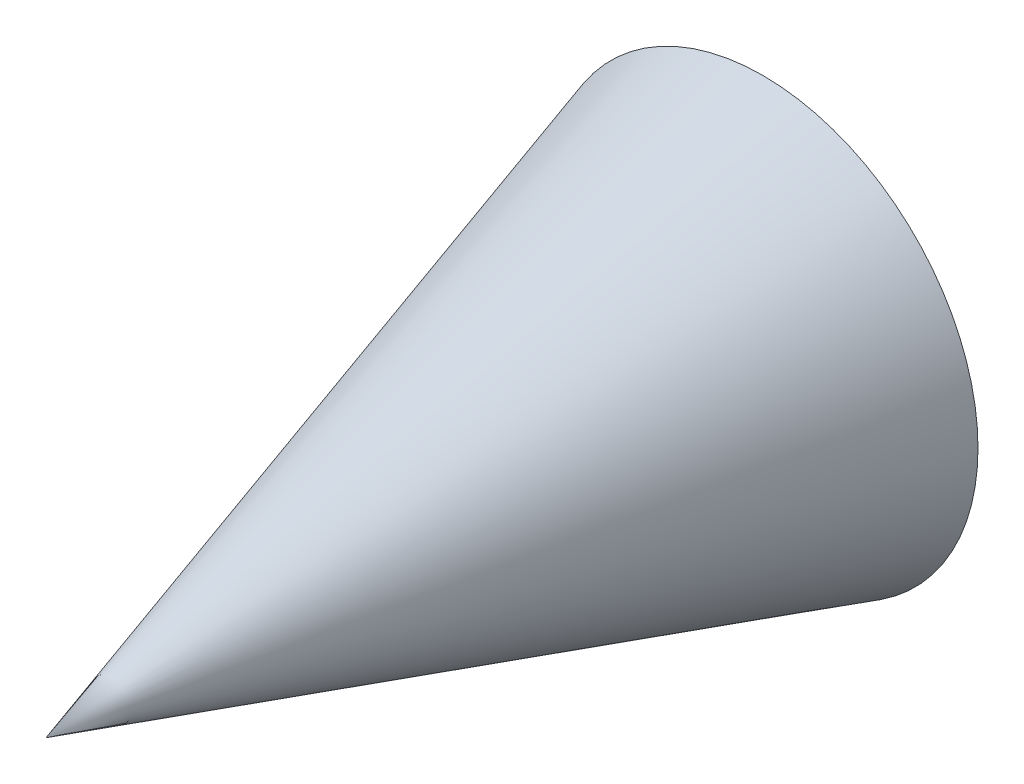
ISO-10303-21;
HEADER;
FILE_DESCRIPTION(('STEP AP214'),'2;1');
FILE_NAME('part.step','',(''),(''),'','','');
FILE_SCHEMA(('AUTOMOTIVE_DESIGN { 1 0 10303 214 1 1 1 1 }'));
ENDSEC;
DATA;
#1=APPLICATION_CONTEXT('core data for automotive mechanical design processes');
#2=APPLICATION_PROTOCOL_DEFINITION('international standard','automotive_design',2000,#1);
#3=PRODUCT_CONTEXT('',#1,'mechanical');
#4=PRODUCT('Part','Part','',(#3));
#5=PRODUCT_RELATED_PRODUCT_CATEGORY('part','',(#4));
#6=PRODUCT_DEFINITION_FORMATION('','',#4);
#7=PRODUCT_DEFINITION_CONTEXT('part definition',#1,'design');
#8=PRODUCT_DEFINITION('design','',#6,#7);
#9=PRODUCT_DEFINITION_SHAPE('','',#8);
#10=(LENGTH_UNIT() NAMED_UNIT(*) SI_UNIT(.MILLI.,.METRE.));
#11=(NAMED_UNIT(*) PLANE_ANGLE_UNIT() SI_UNIT($,.RADIAN.));
#12=(NAMED_UNIT(*) SI_UNIT($,.STERADIAN.) SOLID_ANGLE_UNIT());
#13=UNCERTAINTY_MEASURE_WITH_UNIT(LENGTH_MEASURE(1.E-05),#10,'distance_accuracy_value','');
#14=(GEOMETRIC_REPRESENTATION_CONTEXT(3) GLOBAL_UNCERTAINTY_ASSIGNED_CONTEXT((#13)) GLOBAL_UNIT_ASSIGNED_CONTEXT((#10,
#11,#12)) REPRESENTATION_CONTEXT('',''));
#15=CARTESIAN_POINT('',(0.,0.,0.));
#16=DIRECTION('',(0.,0.,1.));
#17=DIRECTION('',(1.,0.,0.));
#18=AXIS2_PLACEMENT_3D('',#15,#16,#17);
#19=CARTESIAN_POINT('',(0.,0.,0.));
#20=DIRECTION('',(0.,0.,-1.));
#21=DIRECTION('',(-1.,0.,0.));
#22=AXIS2_PLACEMENT_3D('',#19,#20,#21);
#23=PLANE('',#22);
#24=CARTESIAN_POINT('',(0.,0.,0.));
#25=DIRECTION('',(0.,0.,-1.));
#26=DIRECTION('',(-1.,0.,0.));
#27=AXIS2_PLACEMENT_3D('',#24,#25,#26);
#28=CIRCLE('',#27,30.);
#29=CARTESIAN_POINT('',(-30.,0.,0.));
#30=VERTEX_POINT('',#29);
#31=EDGE_CURVE('E11',#30,#30,#28,.T.);
#32=ORIENTED_EDGE('',*,*,#31,.T.);
#33=EDGE_LOOP('',(#32));
#34=FACE_BOUND('',#33,.T.);
#35=ADVANCED_FACE('F39',(#34),#23,.T.);
#36=CARTESIAN_POINT('',(0.,0.,0.));
#37=DIRECTION('',(0.,0.,-1.));
#38=DIRECTION('',(-1.,0.,0.));
#39=AXIS2_PLACEMENT_3D('',#36,#37,#38);
#40=CONICAL_SURFACE('',#39,30.,0.291456794477867);
#41=CARTESIAN_POINT('',(0.,0.,100.));
#42=VERTEX_POINT('',#41);
#43=VERTEX_LOOP('',#42);
#44=FACE_BOUND('',#43,.T.);
#45=ORIENTED_EDGE('',*,*,#31,.F.);
#46=EDGE_LOOP('',(#45));
#47=FACE_BOUND('',#46,.T.);
#48=ADVANCED_FACE('F46',(#44,#47),#40,.T.);
#49=CLOSED_SHELL('',(#35,#48));
#50=MANIFOLD_SOLID_BREP('B2',#49);
#51=ADVANCED_BREP_SHAPE_REPRESENTATION('',(#18,#50),#14);
#52=SHAPE_DEFINITION_REPRESENTATION(#9,#51);
ENDSEC;
END-ISO-10303-21;
